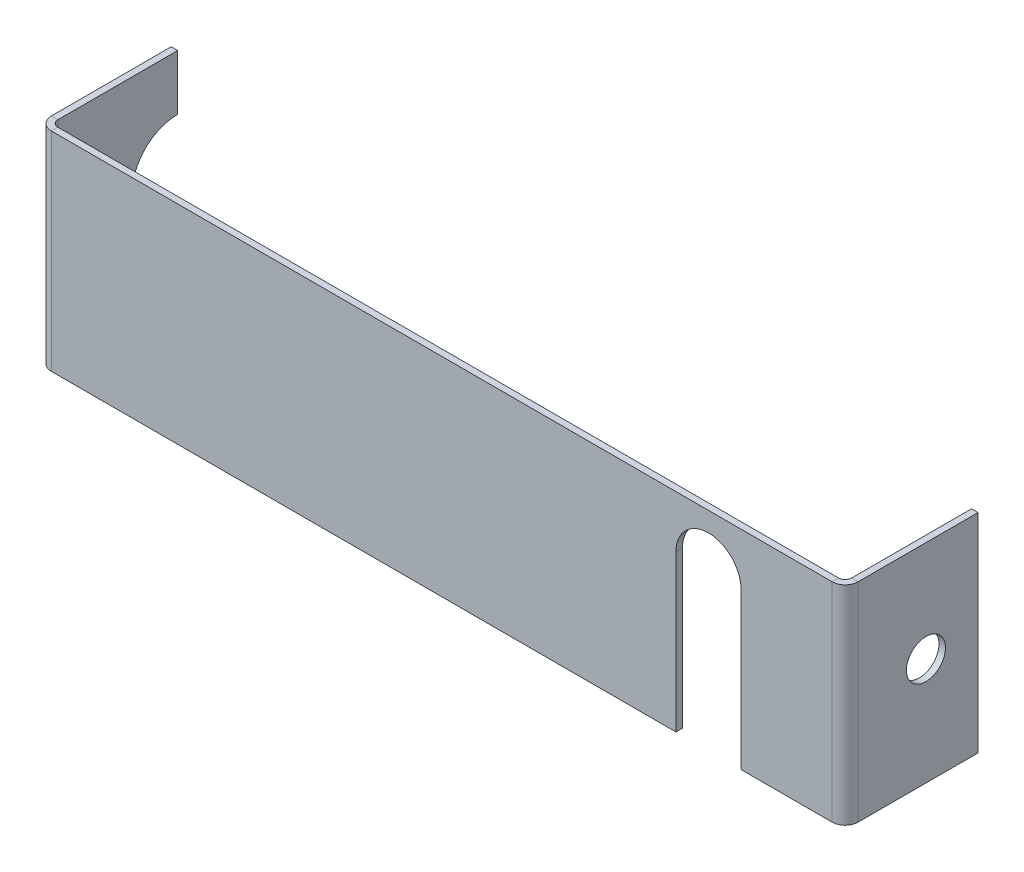
ISO-10303-21;
HEADER;
FILE_DESCRIPTION(('STEP AP214'),'2;1');
FILE_NAME('part.step','',(''),(''),'','','');
FILE_SCHEMA(('AUTOMOTIVE_DESIGN { 1 0 10303 214 1 1 1 1 }'));
ENDSEC;
DATA;
#1=APPLICATION_CONTEXT('core data for automotive mechanical design processes');
#2=APPLICATION_PROTOCOL_DEFINITION('international standard','automotive_design',2000,#1);
#3=PRODUCT_CONTEXT('',#1,'mechanical');
#4=PRODUCT('Part','Part','',(#3));
#5=PRODUCT_RELATED_PRODUCT_CATEGORY('part','',(#4));
#6=PRODUCT_DEFINITION_FORMATION('','',#4);
#7=PRODUCT_DEFINITION_CONTEXT('part definition',#1,'design');
#8=PRODUCT_DEFINITION('design','',#6,#7);
#9=PRODUCT_DEFINITION_SHAPE('','',#8);
#10=(LENGTH_UNIT() NAMED_UNIT(*) SI_UNIT(.MILLI.,.METRE.));
#11=(NAMED_UNIT(*) PLANE_ANGLE_UNIT() SI_UNIT($,.RADIAN.));
#12=(NAMED_UNIT(*) SI_UNIT($,.STERADIAN.) SOLID_ANGLE_UNIT());
#13=UNCERTAINTY_MEASURE_WITH_UNIT(LENGTH_MEASURE(1.E-05),#10,'distance_accuracy_value','');
#14=(GEOMETRIC_REPRESENTATION_CONTEXT(3) GLOBAL_UNCERTAINTY_ASSIGNED_CONTEXT((#13)) GLOBAL_UNIT_ASSIGNED_CONTEXT((#10,
#11,#12)) REPRESENTATION_CONTEXT('',''));
#15=CARTESIAN_POINT('',(0.,0.,0.));
#16=DIRECTION('',(0.,0.,1.));
#17=DIRECTION('',(1.,0.,0.));
#18=AXIS2_PLACEMENT_3D('',#15,#16,#17);
#19=CARTESIAN_POINT('',(-58.4390862944158,0.,15.3064805414552));
#20=DIRECTION('',(0.,-1.,0.));
#21=DIRECTION('',(0.,0.,-1.));
#22=AXIS2_PLACEMENT_3D('',#19,#20,#21);
#23=PLANE('',#22);
#24=DIRECTION('',(0.,0.,1.));
#25=VECTOR('',#24,1.);
#26=CARTESIAN_POINT('',(-4.93908629441583,0.,15.8064805414552));
#27=LINE('',#26,#25);
#28=CARTESIAN_POINT('',(-4.93908629441583,0.,15.8064805414552));
#29=VERTEX_POINT('',#28);
#30=CARTESIAN_POINT('',(-4.93908629441583,0.,16.3064805414552));
#31=VERTEX_POINT('',#30);
#32=EDGE_CURVE('E192',#29,#31,#27,.T.);
#33=ORIENTED_EDGE('',*,*,#32,.F.);
#34=DIRECTION('',(1.,0.,0.));
#35=VECTOR('',#34,1.);
#36=CARTESIAN_POINT('',(-58.9390862944158,0.,15.8064805414552));
#37=LINE('',#36,#35);
#38=CARTESIAN_POINT('',(2.06091370558417,0.,15.8064805414552));
#39=VERTEX_POINT('',#38);
#40=EDGE_CURVE('E277',#29,#39,#37,.T.);
#41=ORIENTED_EDGE('',*,*,#40,.T.);
#42=DIRECTION('',(0.,0.,1.));
#43=VECTOR('',#42,1.);
#44=CARTESIAN_POINT('',(2.06091370558417,0.,15.8064805414552));
#45=LINE('',#44,#43);
#46=CARTESIAN_POINT('',(2.06091370558417,0.,16.3064805414552));
#47=VERTEX_POINT('',#46);
#48=EDGE_CURVE('E319',#39,#47,#45,.T.);
#49=ORIENTED_EDGE('',*,*,#48,.T.);
#50=DIRECTION('',(1.,0.,0.));
#51=VECTOR('',#50,1.);
#52=CARTESIAN_POINT('',(-58.9390862944158,0.,16.3064805414552));
#53=LINE('',#52,#51);
#54=EDGE_CURVE('E290',#31,#47,#53,.T.);
#55=ORIENTED_EDGE('',*,*,#54,.F.);
#56=EDGE_LOOP('',(#33,#41,#49,#55));
#57=FACE_BOUND('',#56,.T.);
#58=ADVANCED_FACE('F35',(#57),#23,.T.);
#59=CARTESIAN_POINT('',(-58.439086294416,16.,-3.69351945854482));
#60=DIRECTION('',(1.,0.,0.));
#61=DIRECTION('',(0.,0.,-1.));
#62=AXIS2_PLACEMENT_3D('',#59,#60,#61);
#63=PLANE('',#62);
#64=CARTESIAN_POINT('',(-58.4390862944159,8.25,11.5723525231939));
#65=DIRECTION('',(-1.,0.,0.));
#66=DIRECTION('',(0.,0.,1.));
#67=AXIS2_PLACEMENT_3D('',#64,#65,#66);
#68=CIRCLE('',#67,1.5);
#69=CARTESIAN_POINT('',(-58.4390862944159,8.25,13.0723525231939));
#70=VERTEX_POINT('',#69);
#71=EDGE_CURVE('E215',#70,#70,#68,.T.);
#72=ORIENTED_EDGE('',*,*,#71,.T.);
#73=EDGE_LOOP('',(#72));
#74=FACE_BOUND('',#73,.T.);
#75=CARTESIAN_POINT('',(-58.4390862944159,8.25,6.11235252319387));
#76=DIRECTION('',(-1.,0.,0.));
#77=DIRECTION('',(0.,0.,1.));
#78=AXIS2_PLACEMENT_3D('',#75,#76,#77);
#79=CIRCLE('',#78,3.5);
#80=CARTESIAN_POINT('',(-58.4390862944159,8.25,9.61235252319387));
#81=VERTEX_POINT('',#80);
#82=CARTESIAN_POINT('',(-58.4390862944159,11.75,6.11235252319387));
#83=VERTEX_POINT('',#82);
#84=EDGE_CURVE('E196',#81,#83,#79,.T.);
#85=ORIENTED_EDGE('',*,*,#84,.T.);
#86=DIRECTION('',(0.,-0.999991766384682,0.00405797521467765));
#87=VECTOR('',#86,1.);
#88=CARTESIAN_POINT('',(-58.4390862944159,-11.4603827869251,6.2065404567736));
#89=LINE('',#88,#87);
#90=CARTESIAN_POINT('',(-58.4390862944159,16.,6.09510598653014));
#91=VERTEX_POINT('',#90);
#92=EDGE_CURVE('E198',#91,#83,#89,.T.);
#93=ORIENTED_EDGE('',*,*,#92,.F.);
#94=DIRECTION('',(0.,0.,1.));
#95=VECTOR('',#94,1.);
#96=CARTESIAN_POINT('',(-58.439086294416,16.,-3.69351945854482));
#97=LINE('',#96,#95);
#98=CARTESIAN_POINT('',(-58.4390862944158,16.,15.3064805414552));
#99=VERTEX_POINT('',#98);
#100=EDGE_CURVE('E255',#91,#99,#97,.T.);
#101=ORIENTED_EDGE('',*,*,#100,.T.);
#102=DIRECTION('',(0.,-1.,0.));
#103=VECTOR('',#102,1.);
#104=CARTESIAN_POINT('',(-58.4390862944158,16.,15.3064805414552));
#105=LINE('',#104,#103);
#106=CARTESIAN_POINT('',(-58.4390862944158,0.,15.3064805414552));
#107=VERTEX_POINT('',#106);
#108=EDGE_CURVE('E307',#99,#107,#105,.T.);
#109=ORIENTED_EDGE('',*,*,#108,.T.);
#110=DIRECTION('',(0.,0.,1.));
#111=VECTOR('',#110,1.);
#112=CARTESIAN_POINT('',(-58.439086294416,0.,-3.69351945854482));
#113=LINE('',#112,#111);
#114=CARTESIAN_POINT('',(-58.4390862944159,0.,9.61235252319387));
#115=VERTEX_POINT('',#114);
#116=EDGE_CURVE('E283',#115,#107,#113,.T.);
#117=ORIENTED_EDGE('',*,*,#116,.F.);
#118=DIRECTION('',(0.,1.,0.));
#119=VECTOR('',#118,1.);
#120=CARTESIAN_POINT('',(-58.4390862944159,16.,9.61235252319387));
#121=LINE('',#120,#119);
#122=EDGE_CURVE('E58',#115,#81,#121,.T.);
#123=ORIENTED_EDGE('',*,*,#122,.T.);
#124=EDGE_LOOP('',(#85,#93,#101,#109,#117,#123));
#125=FACE_BOUND('',#124,.T.);
#126=ADVANCED_FACE('F372',(#74,#125),#63,.T.);
#127=CARTESIAN_POINT('',(-58.939086294416,16.,-3.69351945854482));
#128=DIRECTION('',(1.,0.,0.));
#129=DIRECTION('',(0.,0.,-1.));
#130=AXIS2_PLACEMENT_3D('',#127,#128,#129);
#131=PLANE('',#130);
#132=CARTESIAN_POINT('',(-58.9390862944159,8.25,11.5723525231939));
#133=DIRECTION('',(-1.,0.,0.));
#134=DIRECTION('',(0.,0.,1.));
#135=AXIS2_PLACEMENT_3D('',#132,#133,#134);
#136=CIRCLE('',#135,1.5);
#137=CARTESIAN_POINT('',(-58.9390862944159,8.25,13.0723525231939));
#138=VERTEX_POINT('',#137);
#139=EDGE_CURVE('E217',#138,#138,#136,.T.);
#140=ORIENTED_EDGE('',*,*,#139,.F.);
#141=EDGE_LOOP('',(#140));
#142=FACE_BOUND('',#141,.T.);
#143=DIRECTION('',(0.,-0.999991766384682,0.00405797521467765));
#144=VECTOR('',#143,1.);
#145=CARTESIAN_POINT('',(-58.9390862944159,-11.4603827869251,6.20654045677361));
#146=LINE('',#145,#144);
#147=CARTESIAN_POINT('',(-58.9390862944159,16.,6.09510598653015));
#148=VERTEX_POINT('',#147);
#149=CARTESIAN_POINT('',(-58.9390862944159,11.75,6.11235252319387));
#150=VERTEX_POINT('',#149);
#151=EDGE_CURVE('E197',#148,#150,#146,.T.);
#152=ORIENTED_EDGE('',*,*,#151,.T.);
#153=CARTESIAN_POINT('',(-58.9390862944159,8.25,6.11235252319387));
#154=DIRECTION('',(-1.,0.,0.));
#155=DIRECTION('',(0.,0.,1.));
#156=AXIS2_PLACEMENT_3D('',#153,#154,#155);
#157=CIRCLE('',#156,3.5);
#158=CARTESIAN_POINT('',(-58.9390862944159,8.25,9.61235252319388));
#159=VERTEX_POINT('',#158);
#160=EDGE_CURVE('E204',#159,#150,#157,.T.);
#161=ORIENTED_EDGE('',*,*,#160,.F.);
#162=DIRECTION('',(0.,1.,0.));
#163=VECTOR('',#162,1.);
#164=CARTESIAN_POINT('',(-58.9390862944159,-11.4620062335126,9.61235252319388));
#165=LINE('',#164,#163);
#166=CARTESIAN_POINT('',(-58.9390862944159,0.,9.61235252319387));
#167=VERTEX_POINT('',#166);
#168=EDGE_CURVE('E191',#167,#159,#165,.T.);
#169=ORIENTED_EDGE('',*,*,#168,.F.);
#170=DIRECTION('',(0.,0.,1.));
#171=VECTOR('',#170,1.);
#172=CARTESIAN_POINT('',(-58.939086294416,0.,-3.69351945854482));
#173=LINE('',#172,#171);
#174=CARTESIAN_POINT('',(-58.9390862944158,0.,15.3064805414552));
#175=VERTEX_POINT('',#174);
#176=EDGE_CURVE('E285',#167,#175,#173,.T.);
#177=ORIENTED_EDGE('',*,*,#176,.T.);
#178=DIRECTION('',(0.,-1.,0.));
#179=VECTOR('',#178,1.);
#180=CARTESIAN_POINT('',(-58.9390862944158,16.,15.3064805414552));
#181=LINE('',#180,#179);
#182=CARTESIAN_POINT('',(-58.9390862944158,16.,15.3064805414552));
#183=VERTEX_POINT('',#182);
#184=EDGE_CURVE('E304',#183,#175,#181,.T.);
#185=ORIENTED_EDGE('',*,*,#184,.F.);
#186=DIRECTION('',(0.,0.,1.));
#187=VECTOR('',#186,1.);
#188=CARTESIAN_POINT('',(-58.939086294416,16.,-3.69351945854482));
#189=LINE('',#188,#187);
#190=EDGE_CURVE('E257',#148,#183,#189,.T.);
#191=ORIENTED_EDGE('',*,*,#190,.F.);
#192=EDGE_LOOP('',(#152,#161,#169,#177,#185,#191));
#193=FACE_BOUND('',#192,.T.);
#194=ADVANCED_FACE('F380',(#142,#193),#131,.F.);
#195=CARTESIAN_POINT('',(-57.9390862944158,16.,15.8064805414552));
#196=DIRECTION('',(0.,1.,0.));
#197=DIRECTION('',(0.,0.,1.));
#198=AXIS2_PLACEMENT_3D('',#195,#196,#197);
#199=PLANE('',#198);
#200=ORIENTED_EDGE('',*,*,#100,.F.);
#201=DIRECTION('',(-1.,0.,0.));
#202=VECTOR('',#201,1.);
#203=CARTESIAN_POINT('',(-58.9390862944159,16.,6.09510598653015));
#204=LINE('',#203,#202);
#205=EDGE_CURVE('E210',#148,#91,#204,.F.);
#206=ORIENTED_EDGE('',*,*,#205,.F.);
#207=ORIENTED_EDGE('',*,*,#190,.T.);
#208=DIRECTION('',(1.,0.,0.));
#209=VECTOR('',#208,1.);
#210=CARTESIAN_POINT('',(-58.9390862944158,16.,15.3064805414552));
#211=LINE('',#210,#209);
#212=EDGE_CURVE('E11',#183,#99,#211,.T.);
#213=ORIENTED_EDGE('',*,*,#212,.T.);
#214=EDGE_LOOP('',(#200,#206,#207,#213));
#215=FACE_BOUND('',#214,.T.);
#216=ADVANCED_FACE('F377',(#215),#199,.T.);
#217=CARTESIAN_POINT('',(2.06091370558417,0.,15.3064805414552));
#218=DIRECTION('',(0.,1.,0.));
#219=DIRECTION('',(1.,0.,0.));
#220=AXIS2_PLACEMENT_3D('',#217,#218,#219);
#221=PLANE('',#220);
#222=DIRECTION('',(-1.,0.,0.));
#223=VECTOR('',#222,1.);
#224=CARTESIAN_POINT('',(-58.9390862944159,0.,9.61235252319387));
#225=LINE('',#224,#223);
#226=EDGE_CURVE('E208',#167,#115,#225,.F.);
#227=ORIENTED_EDGE('',*,*,#226,.T.);
#228=ORIENTED_EDGE('',*,*,#116,.T.);
#229=DIRECTION('',(-1.,0.,0.));
#230=VECTOR('',#229,1.);
#231=CARTESIAN_POINT('',(-58.4390862944158,0.,15.3064805414552));
#232=LINE('',#231,#230);
#233=EDGE_CURVE('E328',#107,#175,#232,.T.);
#234=ORIENTED_EDGE('',*,*,#233,.T.);
#235=ORIENTED_EDGE('',*,*,#176,.F.);
#236=EDGE_LOOP('',(#227,#228,#234,#235));
#237=FACE_BOUND('',#236,.T.);
#238=ADVANCED_FACE('F437',(#237),#221,.F.);
#239=CARTESIAN_POINT('',(2.06091370558417,0.,15.8064805414552));
#240=DIRECTION('',(0.,-1.,0.));
#241=DIRECTION('',(0.,0.,-1.));
#242=AXIS2_PLACEMENT_3D('',#239,#240,#241);
#243=PLANE('',#242);
#244=DIRECTION('',(0.,0.,-1.));
#245=VECTOR('',#244,1.);
#246=CARTESIAN_POINT('',(2.56091370558417,0.,16.3064805414552));
#247=LINE('',#246,#245);
#248=CARTESIAN_POINT('',(2.56091370558417,0.,15.3064805414552));
#249=VERTEX_POINT('',#248);
#250=CARTESIAN_POINT('',(2.56091370558417,0.,6.09510598652942));
#251=VERTEX_POINT('',#250);
#252=EDGE_CURVE('E271',#249,#251,#247,.T.);
#253=ORIENTED_EDGE('',*,*,#252,.T.);
#254=DIRECTION('',(1.,0.,0.));
#255=VECTOR('',#254,1.);
#256=CARTESIAN_POINT('',(2.56091370558417,0.,6.09510598652942));
#257=LINE('',#256,#255);
#258=CARTESIAN_POINT('',(3.06091370558417,0.,6.09510598652942));
#259=VERTEX_POINT('',#258);
#260=EDGE_CURVE('E231',#251,#259,#257,.T.);
#261=ORIENTED_EDGE('',*,*,#260,.T.);
#262=DIRECTION('',(0.,0.,-1.));
#263=VECTOR('',#262,1.);
#264=CARTESIAN_POINT('',(3.06091370558417,0.,16.3064805414552));
#265=LINE('',#264,#263);
#266=CARTESIAN_POINT('',(3.06091370558417,0.,15.3064805414552));
#267=VERTEX_POINT('',#266);
#268=EDGE_CURVE('E236',#267,#259,#265,.T.);
#269=ORIENTED_EDGE('',*,*,#268,.F.);
#270=DIRECTION('',(-1.,0.,0.));
#271=VECTOR('',#270,1.);
#272=CARTESIAN_POINT('',(3.06091370558417,0.,15.3064805414552));
#273=LINE('',#272,#271);
#274=EDGE_CURVE('E322',#267,#249,#273,.T.);
#275=ORIENTED_EDGE('',*,*,#274,.T.);
#276=EDGE_LOOP('',(#253,#261,#269,#275));
#277=FACE_BOUND('',#276,.T.);
#278=ADVANCED_FACE('F399',(#277),#243,.T.);
#279=CARTESIAN_POINT('',(3.06091370558417,16.,16.3064805414552));
#280=DIRECTION('',(-1.,0.,0.));
#281=DIRECTION('',(0.,0.,1.));
#282=AXIS2_PLACEMENT_3D('',#279,#280,#281);
#283=PLANE('',#282);
#284=CARTESIAN_POINT('',(3.06091370558417,8.25,10.0951059865294));
#285=DIRECTION('',(1.,0.,0.));
#286=DIRECTION('',(0.,0.,-1.));
#287=AXIS2_PLACEMENT_3D('',#284,#285,#286);
#288=CIRCLE('',#287,1.5);
#289=CARTESIAN_POINT('',(3.06091370558417,8.25,8.59510598652943));
#290=VERTEX_POINT('',#289);
#291=EDGE_CURVE('E220',#290,#290,#288,.T.);
#292=ORIENTED_EDGE('',*,*,#291,.F.);
#293=EDGE_LOOP('',(#292));
#294=FACE_BOUND('',#293,.T.);
#295=DIRECTION('',(0.,1.,0.));
#296=VECTOR('',#295,1.);
#297=CARTESIAN_POINT('',(3.06091370558417,8.02636119023603,6.09510598652942));
#298=LINE('',#297,#296);
#299=CARTESIAN_POINT('',(3.06091370558417,16.,6.09510598652942));
#300=VERTEX_POINT('',#299);
#301=EDGE_CURVE('E226',#259,#300,#298,.T.);
#302=ORIENTED_EDGE('',*,*,#301,.T.);
#303=DIRECTION('',(0.,0.,-1.));
#304=VECTOR('',#303,1.);
#305=CARTESIAN_POINT('',(3.06091370558417,16.,16.3064805414552));
#306=LINE('',#305,#304);
#307=CARTESIAN_POINT('',(3.06091370558417,16.,15.3064805414552));
#308=VERTEX_POINT('',#307);
#309=EDGE_CURVE('E239',#308,#300,#306,.T.);
#310=ORIENTED_EDGE('',*,*,#309,.F.);
#311=DIRECTION('',(0.,-1.,0.));
#312=VECTOR('',#311,1.);
#313=CARTESIAN_POINT('',(3.06091370558417,16.,15.3064805414552));
#314=LINE('',#313,#312);
#315=EDGE_CURVE('E268',#308,#267,#314,.T.);
#316=ORIENTED_EDGE('',*,*,#315,.T.);
#317=ORIENTED_EDGE('',*,*,#268,.T.);
#318=EDGE_LOOP('',(#302,#310,#316,#317));
#319=FACE_BOUND('',#318,.T.);
#320=ADVANCED_FACE('F397',(#294,#319),#283,.F.);
#321=CARTESIAN_POINT('',(2.56091370558417,16.,16.3064805414552));
#322=DIRECTION('',(-1.,0.,0.));
#323=DIRECTION('',(0.,0.,1.));
#324=AXIS2_PLACEMENT_3D('',#321,#322,#323);
#325=PLANE('',#324);
#326=CARTESIAN_POINT('',(2.56091370558417,8.25,10.0951059865294));
#327=DIRECTION('',(1.,0.,0.));
#328=DIRECTION('',(0.,0.,-1.));
#329=AXIS2_PLACEMENT_3D('',#326,#327,#328);
#330=CIRCLE('',#329,1.5);
#331=CARTESIAN_POINT('',(2.56091370558417,8.25,8.59510598652943));
#332=VERTEX_POINT('',#331);
#333=EDGE_CURVE('E223',#332,#332,#330,.T.);
#334=ORIENTED_EDGE('',*,*,#333,.T.);
#335=EDGE_LOOP('',(#334));
#336=FACE_BOUND('',#335,.T.);
#337=DIRECTION('',(0.,0.,-1.));
#338=VECTOR('',#337,1.);
#339=CARTESIAN_POINT('',(2.56091370558417,16.,16.3064805414552));
#340=LINE('',#339,#338);
#341=CARTESIAN_POINT('',(2.56091370558417,16.,15.3064805414552));
#342=VERTEX_POINT('',#341);
#343=CARTESIAN_POINT('',(2.56091370558417,16.,6.09510598652942));
#344=VERTEX_POINT('',#343);
#345=EDGE_CURVE('E242',#342,#344,#340,.T.);
#346=ORIENTED_EDGE('',*,*,#345,.T.);
#347=DIRECTION('',(0.,1.,0.));
#348=VECTOR('',#347,1.);
#349=CARTESIAN_POINT('',(2.56091370558417,8.02636119023603,6.09510598652942));
#350=LINE('',#349,#348);
#351=EDGE_CURVE('E229',#251,#344,#350,.T.);
#352=ORIENTED_EDGE('',*,*,#351,.F.);
#353=ORIENTED_EDGE('',*,*,#252,.F.);
#354=DIRECTION('',(0.,-1.,0.));
#355=VECTOR('',#354,1.);
#356=CARTESIAN_POINT('',(2.56091370558417,16.,15.3064805414552));
#357=LINE('',#356,#355);
#358=EDGE_CURVE('E316',#342,#249,#357,.T.);
#359=ORIENTED_EDGE('',*,*,#358,.F.);
#360=EDGE_LOOP('',(#346,#352,#353,#359));
#361=FACE_BOUND('',#360,.T.);
#362=ADVANCED_FACE('F406',(#336,#361),#325,.T.);
#363=CARTESIAN_POINT('',(2.06091370558417,16.,15.3064805414552));
#364=DIRECTION('',(0.,1.,0.));
#365=DIRECTION('',(1.,0.,0.));
#366=AXIS2_PLACEMENT_3D('',#363,#364,#365);
#367=PLANE('',#366);
#368=ORIENTED_EDGE('',*,*,#309,.T.);
#369=DIRECTION('',(1.,0.,0.));
#370=VECTOR('',#369,1.);
#371=CARTESIAN_POINT('',(2.56091370558417,16.,6.09510598652942));
#372=LINE('',#371,#370);
#373=EDGE_CURVE('E234',#344,#300,#372,.T.);
#374=ORIENTED_EDGE('',*,*,#373,.F.);
#375=ORIENTED_EDGE('',*,*,#345,.F.);
#376=DIRECTION('',(1.,0.,0.));
#377=VECTOR('',#376,1.);
#378=CARTESIAN_POINT('',(2.56091370558417,16.,15.3064805414552));
#379=LINE('',#378,#377);
#380=EDGE_CURVE('E324',#342,#308,#379,.T.);
#381=ORIENTED_EDGE('',*,*,#380,.T.);
#382=EDGE_LOOP('',(#368,#374,#375,#381));
#383=FACE_BOUND('',#382,.T.);
#384=ADVANCED_FACE('F409',(#383),#367,.T.);
#385=CARTESIAN_POINT('',(-58.9390862944158,16.,15.3064805414552));
#386=DIRECTION('',(0.,1.,0.));
#387=DIRECTION('',(0.,0.,1.));
#388=AXIS2_PLACEMENT_3D('',#385,#386,#387);
#389=PLANE('',#388);
#390=ORIENTED_EDGE('',*,*,#212,.F.);
#391=CARTESIAN_POINT('',(-57.9390862944158,16.,15.3064805414552));
#392=DIRECTION('',(0.,-1.,0.));
#393=DIRECTION('',(0.,0.,-1.));
#394=AXIS2_PLACEMENT_3D('',#391,#392,#393);
#395=CIRCLE('',#394,1.);
#396=CARTESIAN_POINT('',(-57.9390862944158,16.,16.3064805414552));
#397=VERTEX_POINT('',#396);
#398=EDGE_CURVE('E259',#183,#397,#395,.F.);
#399=ORIENTED_EDGE('',*,*,#398,.T.);
#400=DIRECTION('',(0.,0.,1.));
#401=VECTOR('',#400,1.);
#402=CARTESIAN_POINT('',(-57.9390862944158,16.,15.8064805414552));
#403=LINE('',#402,#401);
#404=CARTESIAN_POINT('',(-57.9390862944158,16.,15.8064805414552));
#405=VERTEX_POINT('',#404);
#406=EDGE_CURVE('E43',#405,#397,#403,.T.);
#407=ORIENTED_EDGE('',*,*,#406,.F.);
#408=CARTESIAN_POINT('',(-57.9390862944158,16.,15.3064805414552));
#409=DIRECTION('',(0.,1.,0.));
#410=DIRECTION('',(1.,0.,0.));
#411=AXIS2_PLACEMENT_3D('',#408,#409,#410);
#412=CIRCLE('',#411,0.5);
#413=EDGE_CURVE('E252',#99,#405,#412,.T.);
#414=ORIENTED_EDGE('',*,*,#413,.F.);
#415=EDGE_LOOP('',(#390,#399,#407,#414));
#416=FACE_BOUND('',#415,.T.);
#417=ADVANCED_FACE('F37',(#416),#389,.T.);
#418=CARTESIAN_POINT('',(-57.9390862944158,0.,16.3064805414552));
#419=DIRECTION('',(0.,-1.,0.));
#420=DIRECTION('',(0.,0.,-1.));
#421=AXIS2_PLACEMENT_3D('',#418,#419,#420);
#422=PLANE('',#421);
#423=DIRECTION('',(0.,0.,-1.));
#424=VECTOR('',#423,1.);
#425=CARTESIAN_POINT('',(-57.9390862944158,0.,16.3064805414552));
#426=LINE('',#425,#424);
#427=CARTESIAN_POINT('',(-57.9390862944158,0.,16.3064805414552));
#428=VERTEX_POINT('',#427);
#429=CARTESIAN_POINT('',(-57.9390862944158,0.,15.8064805414552));
#430=VERTEX_POINT('',#429);
#431=EDGE_CURVE('E331',#428,#430,#426,.T.);
#432=ORIENTED_EDGE('',*,*,#431,.F.);
#433=CARTESIAN_POINT('',(-57.9390862944158,0.,15.3064805414552));
#434=DIRECTION('',(0.,-1.,0.));
#435=DIRECTION('',(0.,0.,-1.));
#436=AXIS2_PLACEMENT_3D('',#433,#434,#435);
#437=CIRCLE('',#436,1.);
#438=EDGE_CURVE('E287',#175,#428,#437,.F.);
#439=ORIENTED_EDGE('',*,*,#438,.F.);
#440=ORIENTED_EDGE('',*,*,#233,.F.);
#441=CARTESIAN_POINT('',(-57.9390862944158,0.,15.3064805414552));
#442=DIRECTION('',(0.,1.,0.));
#443=DIRECTION('',(1.,0.,0.));
#444=AXIS2_PLACEMENT_3D('',#441,#442,#443);
#445=CIRCLE('',#444,0.5);
#446=EDGE_CURVE('E280',#107,#430,#445,.T.);
#447=ORIENTED_EDGE('',*,*,#446,.T.);
#448=EDGE_LOOP('',(#432,#439,#440,#447));
#449=FACE_BOUND('',#448,.T.);
#450=ADVANCED_FACE('F386',(#449),#422,.T.);
#451=DIRECTION('',(0.,0.,1.));
#452=VECTOR('',#451,1.);
#453=CARTESIAN_POINT('',(-9.93908629441583,0.,15.8064805414552));
#454=LINE('',#453,#452);
#455=CARTESIAN_POINT('',(-9.93908629441583,0.,15.8064805414552));
#456=VERTEX_POINT('',#455);
#457=CARTESIAN_POINT('',(-9.93908629441583,0.,16.3064805414552));
#458=VERTEX_POINT('',#457);
#459=EDGE_CURVE('E167',#456,#458,#454,.T.);
#460=ORIENTED_EDGE('',*,*,#459,.T.);
#461=EDGE_CURVE('E291',#428,#458,#53,.T.);
#462=ORIENTED_EDGE('',*,*,#461,.F.);
#463=ORIENTED_EDGE('',*,*,#431,.T.);
#464=EDGE_CURVE('E278',#430,#456,#37,.T.);
#465=ORIENTED_EDGE('',*,*,#464,.T.);
#466=EDGE_LOOP('',(#460,#462,#463,#465));
#467=FACE_BOUND('',#466,.T.);
#468=ADVANCED_FACE('F388',(#467),#23,.T.);
#469=CARTESIAN_POINT('',(2.06091370558417,16.,16.3064805414552));
#470=DIRECTION('',(0.,1.,0.));
#471=DIRECTION('',(0.,0.,1.));
#472=AXIS2_PLACEMENT_3D('',#469,#470,#471);
#473=PLANE('',#472);
#474=DIRECTION('',(0.,0.,-1.));
#475=VECTOR('',#474,1.);
#476=CARTESIAN_POINT('',(2.06091370558417,16.,16.3064805414552));
#477=LINE('',#476,#475);
#478=CARTESIAN_POINT('',(2.06091370558417,16.,16.3064805414552));
#479=VERTEX_POINT('',#478);
#480=CARTESIAN_POINT('',(2.06091370558417,16.,15.8064805414552));
#481=VERTEX_POINT('',#480);
#482=EDGE_CURVE('E326',#479,#481,#477,.T.);
#483=ORIENTED_EDGE('',*,*,#482,.F.);
#484=CARTESIAN_POINT('',(2.06091370558417,16.,15.3064805414552));
#485=DIRECTION('',(0.,-1.,0.));
#486=DIRECTION('',(0.,0.,-1.));
#487=AXIS2_PLACEMENT_3D('',#484,#485,#486);
#488=CIRCLE('',#487,1.);
#489=EDGE_CURVE('E265',#479,#308,#488,.F.);
#490=ORIENTED_EDGE('',*,*,#489,.T.);
#491=ORIENTED_EDGE('',*,*,#380,.F.);
#492=CARTESIAN_POINT('',(2.06091370558417,16.,15.3064805414552));
#493=DIRECTION('',(0.,1.,0.));
#494=DIRECTION('',(1.,0.,0.));
#495=AXIS2_PLACEMENT_3D('',#492,#493,#494);
#496=CIRCLE('',#495,0.5);
#497=EDGE_CURVE('E246',#481,#342,#496,.T.);
#498=ORIENTED_EDGE('',*,*,#497,.F.);
#499=EDGE_LOOP('',(#483,#490,#491,#498));
#500=FACE_BOUND('',#499,.T.);
#501=ADVANCED_FACE('F359',(#500),#473,.T.);
#502=CARTESIAN_POINT('',(2.56091370558417,16.,15.3064805414552));
#503=DIRECTION('',(0.,1.,0.));
#504=DIRECTION('',(0.,0.,1.));
#505=AXIS2_PLACEMENT_3D('',#502,#503,#504);
#506=PLANE('',#505);
#507=DIRECTION('',(1.,0.,0.));
#508=VECTOR('',#507,1.);
#509=CARTESIAN_POINT('',(-58.9390862944158,16.,16.3064805414552));
#510=LINE('',#509,#508);
#511=EDGE_CURVE('E262',#397,#479,#510,.T.);
#512=ORIENTED_EDGE('',*,*,#511,.T.);
#513=ORIENTED_EDGE('',*,*,#482,.T.);
#514=DIRECTION('',(1.,0.,0.));
#515=VECTOR('',#514,1.);
#516=CARTESIAN_POINT('',(-58.9390862944158,16.,15.8064805414552));
#517=LINE('',#516,#515);
#518=EDGE_CURVE('E249',#405,#481,#517,.T.);
#519=ORIENTED_EDGE('',*,*,#518,.F.);
#520=ORIENTED_EDGE('',*,*,#406,.T.);
#521=EDGE_LOOP('',(#512,#513,#519,#520));
#522=FACE_BOUND('',#521,.T.);
#523=ADVANCED_FACE('F334',(#522),#506,.T.);
#524=CARTESIAN_POINT('',(3.06091370558417,0.,15.3064805414552));
#525=DIRECTION('',(0.,-1.,0.));
#526=DIRECTION('',(0.,0.,-1.));
#527=AXIS2_PLACEMENT_3D('',#524,#525,#526);
#528=PLANE('',#527);
#529=ORIENTED_EDGE('',*,*,#274,.F.);
#530=CARTESIAN_POINT('',(2.06091370558417,0.,15.3064805414552));
#531=DIRECTION('',(0.,-1.,0.));
#532=DIRECTION('',(0.,0.,-1.));
#533=AXIS2_PLACEMENT_3D('',#530,#531,#532);
#534=CIRCLE('',#533,1.);
#535=EDGE_CURVE('E243',#47,#267,#534,.F.);
#536=ORIENTED_EDGE('',*,*,#535,.F.);
#537=ORIENTED_EDGE('',*,*,#48,.F.);
#538=CARTESIAN_POINT('',(2.06091370558417,0.,15.3064805414552));
#539=DIRECTION('',(0.,1.,0.));
#540=DIRECTION('',(1.,0.,0.));
#541=AXIS2_PLACEMENT_3D('',#538,#539,#540);
#542=CIRCLE('',#541,0.5);
#543=EDGE_CURVE('E274',#39,#249,#542,.T.);
#544=ORIENTED_EDGE('',*,*,#543,.T.);
#545=EDGE_LOOP('',(#529,#536,#537,#544));
#546=FACE_BOUND('',#545,.T.);
#547=ADVANCED_FACE('F394',(#546),#528,.T.);
#548=CARTESIAN_POINT('',(2.06091370558417,16.,15.3064805414552));
#549=DIRECTION('',(0.,-1.,0.));
#550=DIRECTION('',(0.,0.,-1.));
#551=AXIS2_PLACEMENT_3D('',#548,#549,#550);
#552=CYLINDRICAL_SURFACE('',#551,0.5);
#553=ORIENTED_EDGE('',*,*,#543,.F.);
#554=DIRECTION('',(0.,-1.,0.));
#555=VECTOR('',#554,1.);
#556=CARTESIAN_POINT('',(2.06091370558417,16.,15.8064805414552));
#557=LINE('',#556,#555);
#558=EDGE_CURVE('E313',#481,#39,#557,.T.);
#559=ORIENTED_EDGE('',*,*,#558,.F.);
#560=ORIENTED_EDGE('',*,*,#497,.T.);
#561=ORIENTED_EDGE('',*,*,#358,.T.);
#562=EDGE_LOOP('',(#553,#559,#560,#561));
#563=FACE_BOUND('',#562,.T.);
#564=ADVANCED_FACE('F365',(#563),#552,.F.);
#565=CARTESIAN_POINT('',(-58.9390862944158,16.,15.8064805414552));
#566=DIRECTION('',(0.,0.,-1.));
#567=DIRECTION('',(-1.,0.,0.));
#568=AXIS2_PLACEMENT_3D('',#565,#566,#567);
#569=PLANE('',#568);
#570=DIRECTION('',(0.,1.,0.));
#571=VECTOR('',#570,1.);
#572=CARTESIAN_POINT('',(-4.93908629441583,0.,15.8064805414552));
#573=LINE('',#572,#571);
#574=CARTESIAN_POINT('',(-4.93908629441584,12.,15.8064805414552));
#575=VERTEX_POINT('',#574);
#576=EDGE_CURVE('E168',#29,#575,#573,.T.);
#577=ORIENTED_EDGE('',*,*,#576,.T.);
#578=CARTESIAN_POINT('',(-7.43908629441583,12.,15.8064805414552));
#579=DIRECTION('',(0.,0.,1.));
#580=DIRECTION('',(1.,0.,0.));
#581=AXIS2_PLACEMENT_3D('',#578,#579,#580);
#582=CIRCLE('',#581,2.5);
#583=CARTESIAN_POINT('',(-9.93908629441584,12.,15.8064805414552));
#584=VERTEX_POINT('',#583);
#585=EDGE_CURVE('E163',#575,#584,#582,.T.);
#586=ORIENTED_EDGE('',*,*,#585,.T.);
#587=DIRECTION('',(0.,-1.,0.));
#588=VECTOR('',#587,1.);
#589=CARTESIAN_POINT('',(-9.93908629441584,12.,15.8064805414552));
#590=LINE('',#589,#588);
#591=EDGE_CURVE('E171',#584,#456,#590,.T.);
#592=ORIENTED_EDGE('',*,*,#591,.T.);
#593=ORIENTED_EDGE('',*,*,#464,.F.);
#594=DIRECTION('',(0.,-1.,0.));
#595=VECTOR('',#594,1.);
#596=CARTESIAN_POINT('',(-57.9390862944158,16.,15.8064805414552));
#597=LINE('',#596,#595);
#598=EDGE_CURVE('E310',#405,#430,#597,.T.);
#599=ORIENTED_EDGE('',*,*,#598,.F.);
#600=ORIENTED_EDGE('',*,*,#518,.T.);
#601=ORIENTED_EDGE('',*,*,#558,.T.);
#602=ORIENTED_EDGE('',*,*,#40,.F.);
#603=EDGE_LOOP('',(#577,#586,#592,#593,#599,#600,#601,#602));
#604=FACE_BOUND('',#603,.T.);
#605=ADVANCED_FACE('F178',(#604),#569,.T.);
#606=CARTESIAN_POINT('',(-57.9390862944158,16.,15.3064805414552));
#607=DIRECTION('',(0.,-1.,0.));
#608=DIRECTION('',(0.,0.,-1.));
#609=AXIS2_PLACEMENT_3D('',#606,#607,#608);
#610=CYLINDRICAL_SURFACE('',#609,0.5);
#611=ORIENTED_EDGE('',*,*,#446,.F.);
#612=ORIENTED_EDGE('',*,*,#108,.F.);
#613=ORIENTED_EDGE('',*,*,#413,.T.);
#614=ORIENTED_EDGE('',*,*,#598,.T.);
#615=EDGE_LOOP('',(#611,#612,#613,#614));
#616=FACE_BOUND('',#615,.T.);
#617=ADVANCED_FACE('F368',(#616),#610,.F.);
#618=CARTESIAN_POINT('',(-57.9390862944158,16.,15.3064805414552));
#619=DIRECTION('',(0.,-1.,0.));
#620=DIRECTION('',(0.,0.,-1.));
#621=AXIS2_PLACEMENT_3D('',#618,#619,#620);
#622=CYLINDRICAL_SURFACE('',#621,1.);
#623=ORIENTED_EDGE('',*,*,#438,.T.);
#624=DIRECTION('',(0.,-1.,0.));
#625=VECTOR('',#624,1.);
#626=CARTESIAN_POINT('',(-57.9390862944158,16.,16.3064805414552));
#627=LINE('',#626,#625);
#628=EDGE_CURVE('E301',#397,#428,#627,.T.);
#629=ORIENTED_EDGE('',*,*,#628,.F.);
#630=ORIENTED_EDGE('',*,*,#398,.F.);
#631=ORIENTED_EDGE('',*,*,#184,.T.);
#632=EDGE_LOOP('',(#623,#629,#630,#631));
#633=FACE_BOUND('',#632,.T.);
#634=ADVANCED_FACE('F345',(#633),#622,.T.);
#635=CARTESIAN_POINT('',(-58.9390862944158,16.,16.3064805414552));
#636=DIRECTION('',(0.,0.,-1.));
#637=DIRECTION('',(-1.,0.,0.));
#638=AXIS2_PLACEMENT_3D('',#635,#636,#637);
#639=PLANE('',#638);
#640=CARTESIAN_POINT('',(-7.43908629441583,12.,16.3064805414552));
#641=DIRECTION('',(0.,0.,1.));
#642=DIRECTION('',(1.,0.,0.));
#643=AXIS2_PLACEMENT_3D('',#640,#641,#642);
#644=CIRCLE('',#643,2.5);
#645=CARTESIAN_POINT('',(-4.93908629441584,12.,16.3064805414552));
#646=VERTEX_POINT('',#645);
#647=CARTESIAN_POINT('',(-9.93908629441583,12.,16.3064805414552));
#648=VERTEX_POINT('',#647);
#649=EDGE_CURVE('E50',#646,#648,#644,.T.);
#650=ORIENTED_EDGE('',*,*,#649,.F.);
#651=DIRECTION('',(0.,1.,0.));
#652=VECTOR('',#651,1.);
#653=CARTESIAN_POINT('',(-4.93908629441583,0.,16.3064805414552));
#654=LINE('',#653,#652);
#655=EDGE_CURVE('E180',#31,#646,#654,.T.);
#656=ORIENTED_EDGE('',*,*,#655,.F.);
#657=ORIENTED_EDGE('',*,*,#54,.T.);
#658=DIRECTION('',(0.,-1.,0.));
#659=VECTOR('',#658,1.);
#660=CARTESIAN_POINT('',(2.06091370558417,16.,16.3064805414552));
#661=LINE('',#660,#659);
#662=EDGE_CURVE('E298',#479,#47,#661,.T.);
#663=ORIENTED_EDGE('',*,*,#662,.F.);
#664=ORIENTED_EDGE('',*,*,#511,.F.);
#665=ORIENTED_EDGE('',*,*,#628,.T.);
#666=ORIENTED_EDGE('',*,*,#461,.T.);
#667=DIRECTION('',(0.,-1.,0.));
#668=VECTOR('',#667,1.);
#669=CARTESIAN_POINT('',(-9.93908629441584,12.,16.3064805414552));
#670=LINE('',#669,#668);
#671=EDGE_CURVE('E183',#648,#458,#670,.T.);
#672=ORIENTED_EDGE('',*,*,#671,.F.);
#673=EDGE_LOOP('',(#650,#656,#657,#663,#664,#665,#666,#672));
#674=FACE_BOUND('',#673,.T.);
#675=ADVANCED_FACE('F349',(#674),#639,.F.);
#676=CARTESIAN_POINT('',(2.06091370558417,16.,15.3064805414552));
#677=DIRECTION('',(0.,-1.,0.));
#678=DIRECTION('',(0.,0.,-1.));
#679=AXIS2_PLACEMENT_3D('',#676,#677,#678);
#680=CYLINDRICAL_SURFACE('',#679,1.);
#681=ORIENTED_EDGE('',*,*,#535,.T.);
#682=ORIENTED_EDGE('',*,*,#315,.F.);
#683=ORIENTED_EDGE('',*,*,#489,.F.);
#684=ORIENTED_EDGE('',*,*,#662,.T.);
#685=EDGE_LOOP('',(#681,#682,#683,#684));
#686=FACE_BOUND('',#685,.T.);
#687=ADVANCED_FACE('F356',(#686),#680,.T.);
#688=CARTESIAN_POINT('',(2.56091370558417,8.02636119023603,6.09510598652942));
#689=DIRECTION('',(0.,0.,-1.));
#690=DIRECTION('',(-1.,0.,0.));
#691=AXIS2_PLACEMENT_3D('',#688,#689,#690);
#692=PLANE('',#691);
#693=ORIENTED_EDGE('',*,*,#301,.F.);
#694=ORIENTED_EDGE('',*,*,#260,.F.);
#695=ORIENTED_EDGE('',*,*,#351,.T.);
#696=ORIENTED_EDGE('',*,*,#373,.T.);
#697=EDGE_LOOP('',(#693,#694,#695,#696));
#698=FACE_BOUND('',#697,.T.);
#699=ADVANCED_FACE('F403',(#698),#692,.T.);
#700=CARTESIAN_POINT('',(2.56091370558417,8.25,10.0951059865294));
#701=DIRECTION('',(1.,0.,0.));
#702=DIRECTION('',(0.,0.,-1.));
#703=AXIS2_PLACEMENT_3D('',#700,#701,#702);
#704=CYLINDRICAL_SURFACE('',#703,1.5);
#705=ORIENTED_EDGE('',*,*,#333,.F.);
#706=EDGE_LOOP('',(#705));
#707=FACE_BOUND('',#706,.T.);
#708=ORIENTED_EDGE('',*,*,#291,.T.);
#709=EDGE_LOOP('',(#708));
#710=FACE_BOUND('',#709,.T.);
#711=ADVANCED_FACE('F509',(#707,#710),#704,.F.);
#712=CARTESIAN_POINT('',(-58.4390862944159,8.25,11.5723525231939));
#713=DIRECTION('',(-1.,0.,0.));
#714=DIRECTION('',(0.,0.,1.));
#715=AXIS2_PLACEMENT_3D('',#712,#713,#714);
#716=CYLINDRICAL_SURFACE('',#715,1.5);
#717=ORIENTED_EDGE('',*,*,#139,.T.);
#718=EDGE_LOOP('',(#717));
#719=FACE_BOUND('',#718,.T.);
#720=ORIENTED_EDGE('',*,*,#71,.F.);
#721=EDGE_LOOP('',(#720));
#722=FACE_BOUND('',#721,.T.);
#723=ADVANCED_FACE('F515',(#719,#722),#716,.F.);
#724=CARTESIAN_POINT('',(-58.9390862944159,-11.4603827869251,6.20654045677361));
#725=DIRECTION('',(0.,0.00405797521467765,0.999991766384682));
#726=DIRECTION('',(0.,-0.999991766384682,0.00405797521467765));
#727=AXIS2_PLACEMENT_3D('',#724,#725,#726);
#728=PLANE('',#727);
#729=DIRECTION('',(-1.,0.,0.));
#730=VECTOR('',#729,1.);
#731=CARTESIAN_POINT('',(-58.9390862944159,11.75,6.11235252319387));
#732=LINE('',#731,#730);
#733=EDGE_CURVE('E212',#150,#83,#732,.F.);
#734=ORIENTED_EDGE('',*,*,#733,.F.);
#735=ORIENTED_EDGE('',*,*,#151,.F.);
#736=ORIENTED_EDGE('',*,*,#205,.T.);
#737=ORIENTED_EDGE('',*,*,#92,.T.);
#738=EDGE_LOOP('',(#734,#735,#736,#737));
#739=FACE_BOUND('',#738,.T.);
#740=ADVANCED_FACE('F524',(#739),#728,.F.);
#741=CARTESIAN_POINT('',(-58.9390862944159,-11.4620062335126,9.61235252319388));
#742=DIRECTION('',(0.,0.,-1.));
#743=DIRECTION('',(0.,1.,0.));
#744=AXIS2_PLACEMENT_3D('',#741,#742,#743);
#745=PLANE('',#744);
#746=ORIENTED_EDGE('',*,*,#226,.F.);
#747=ORIENTED_EDGE('',*,*,#168,.T.);
#748=DIRECTION('',(-1.,0.,0.));
#749=VECTOR('',#748,1.);
#750=CARTESIAN_POINT('',(-58.9390862944159,8.25,9.61235252319388));
#751=LINE('',#750,#749);
#752=EDGE_CURVE('E200',#159,#81,#751,.F.);
#753=ORIENTED_EDGE('',*,*,#752,.T.);
#754=ORIENTED_EDGE('',*,*,#122,.F.);
#755=EDGE_LOOP('',(#746,#747,#753,#754));
#756=FACE_BOUND('',#755,.T.);
#757=ADVANCED_FACE('F533',(#756),#745,.T.);
#758=CARTESIAN_POINT('',(-58.9390862944159,8.25,6.11235252319387));
#759=DIRECTION('',(-1.,0.,0.));
#760=DIRECTION('',(0.,0.,1.));
#761=AXIS2_PLACEMENT_3D('',#758,#759,#760);
#762=CYLINDRICAL_SURFACE('',#761,3.5);
#763=ORIENTED_EDGE('',*,*,#160,.T.);
#764=ORIENTED_EDGE('',*,*,#733,.T.);
#765=ORIENTED_EDGE('',*,*,#84,.F.);
#766=ORIENTED_EDGE('',*,*,#752,.F.);
#767=EDGE_LOOP('',(#763,#764,#765,#766));
#768=FACE_BOUND('',#767,.T.);
#769=ADVANCED_FACE('F541',(#768),#762,.F.);
#770=CARTESIAN_POINT('',(-7.43908629441583,12.,15.8064805414552));
#771=DIRECTION('',(0.,0.,1.));
#772=DIRECTION('',(1.,0.,0.));
#773=AXIS2_PLACEMENT_3D('',#770,#771,#772);
#774=CYLINDRICAL_SURFACE('',#773,2.5);
#775=ORIENTED_EDGE('',*,*,#649,.T.);
#776=DIRECTION('',(0.,0.,1.));
#777=VECTOR('',#776,1.);
#778=CARTESIAN_POINT('',(-9.93908629441584,12.,15.8064805414552));
#779=LINE('',#778,#777);
#780=EDGE_CURVE('E159',#584,#648,#779,.T.);
#781=ORIENTED_EDGE('',*,*,#780,.F.);
#782=ORIENTED_EDGE('',*,*,#585,.F.);
#783=DIRECTION('',(0.,0.,1.));
#784=VECTOR('',#783,1.);
#785=CARTESIAN_POINT('',(-4.93908629441584,12.,15.8064805414552));
#786=LINE('',#785,#784);
#787=EDGE_CURVE('E189',#575,#646,#786,.T.);
#788=ORIENTED_EDGE('',*,*,#787,.T.);
#789=EDGE_LOOP('',(#775,#781,#782,#788));
#790=FACE_BOUND('',#789,.T.);
#791=ADVANCED_FACE('F161',(#790),#774,.F.);
#792=CARTESIAN_POINT('',(-4.93908629441583,0.,15.8064805414552));
#793=DIRECTION('',(1.,0.,0.));
#794=DIRECTION('',(0.,1.,0.));
#795=AXIS2_PLACEMENT_3D('',#792,#793,#794);
#796=PLANE('',#795);
#797=ORIENTED_EDGE('',*,*,#655,.T.);
#798=ORIENTED_EDGE('',*,*,#787,.F.);
#799=ORIENTED_EDGE('',*,*,#576,.F.);
#800=ORIENTED_EDGE('',*,*,#32,.T.);
#801=EDGE_LOOP('',(#797,#798,#799,#800));
#802=FACE_BOUND('',#801,.T.);
#803=ADVANCED_FACE('F554',(#802),#796,.F.);
#804=CARTESIAN_POINT('',(-9.93908629441584,12.,15.8064805414552));
#805=DIRECTION('',(-1.,0.,0.));
#806=DIRECTION('',(0.,-1.,0.));
#807=AXIS2_PLACEMENT_3D('',#804,#805,#806);
#808=PLANE('',#807);
#809=ORIENTED_EDGE('',*,*,#671,.T.);
#810=ORIENTED_EDGE('',*,*,#459,.F.);
#811=ORIENTED_EDGE('',*,*,#591,.F.);
#812=ORIENTED_EDGE('',*,*,#780,.T.);
#813=EDGE_LOOP('',(#809,#810,#811,#812));
#814=FACE_BOUND('',#813,.T.);
#815=ADVANCED_FACE('F172',(#814),#808,.F.);
#816=CLOSED_SHELL('',(#58,#126,#194,#216,#238,#278,#320,#362,#384,#417,#450,#468,#501,#523,#547,
#564,#605,#617,#634,#675,#687,#699,#711,#723,#740,#757,#769,#791,#803,#815));
#817=MANIFOLD_SOLID_BREP('B2',#816);
#818=ADVANCED_BREP_SHAPE_REPRESENTATION('',(#18,#817),#14);
#819=SHAPE_DEFINITION_REPRESENTATION(#9,#818);
ENDSEC;
END-ISO-10303-21;
